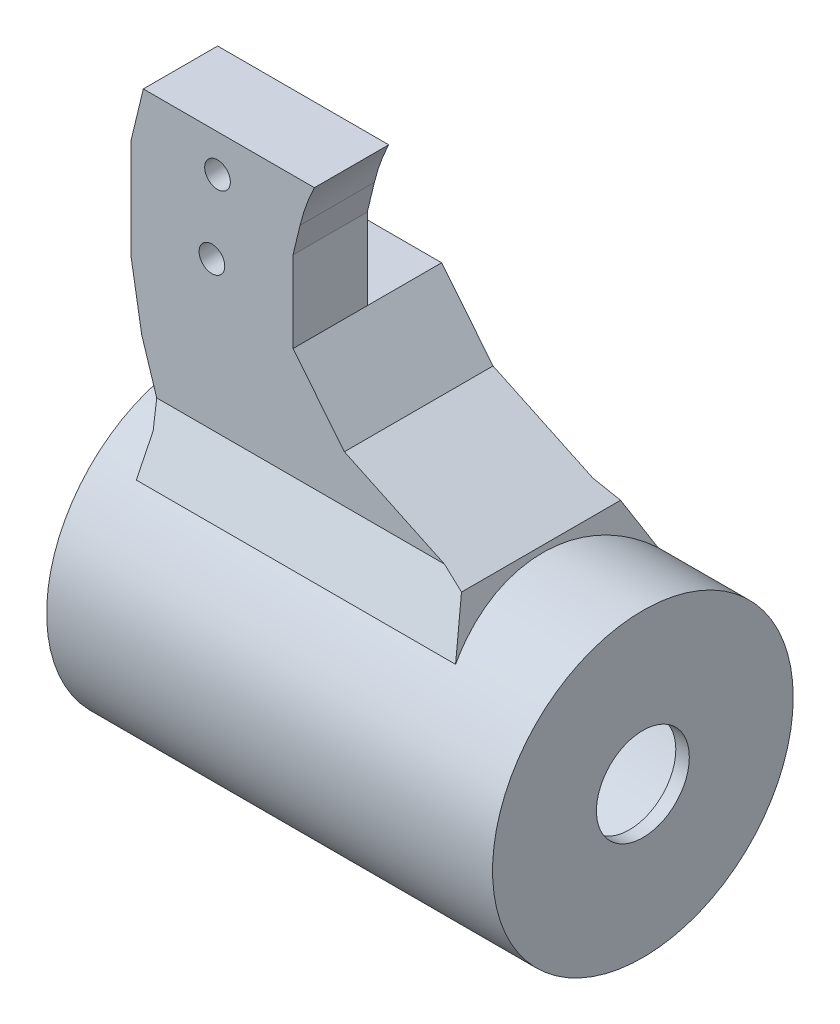
ISO-10303-21;
HEADER;
FILE_DESCRIPTION(('STEP AP214'),'2;1');
FILE_NAME('part.step','',(''),(''),'','','');
FILE_SCHEMA(('AUTOMOTIVE_DESIGN { 1 0 10303 214 1 1 1 1 }'));
ENDSEC;
DATA;
#1=APPLICATION_CONTEXT('core data for automotive mechanical design processes');
#2=APPLICATION_PROTOCOL_DEFINITION('international standard','automotive_design',2000,#1);
#3=PRODUCT_CONTEXT('',#1,'mechanical');
#4=PRODUCT('Part','Part','',(#3));
#5=PRODUCT_RELATED_PRODUCT_CATEGORY('part','',(#4));
#6=PRODUCT_DEFINITION_FORMATION('','',#4);
#7=PRODUCT_DEFINITION_CONTEXT('part definition',#1,'design');
#8=PRODUCT_DEFINITION('design','',#6,#7);
#9=PRODUCT_DEFINITION_SHAPE('','',#8);
#10=(LENGTH_UNIT() NAMED_UNIT(*) SI_UNIT(.MILLI.,.METRE.));
#11=(NAMED_UNIT(*) PLANE_ANGLE_UNIT() SI_UNIT($,.RADIAN.));
#12=(NAMED_UNIT(*) SI_UNIT($,.STERADIAN.) SOLID_ANGLE_UNIT());
#13=UNCERTAINTY_MEASURE_WITH_UNIT(LENGTH_MEASURE(1.E-05),#10,'distance_accuracy_value','');
#14=(GEOMETRIC_REPRESENTATION_CONTEXT(3) GLOBAL_UNCERTAINTY_ASSIGNED_CONTEXT((#13)) GLOBAL_UNIT_ASSIGNED_CONTEXT((#10,
#11,#12)) REPRESENTATION_CONTEXT('',''));
#15=CARTESIAN_POINT('',(0.,0.,0.));
#16=DIRECTION('',(0.,0.,1.));
#17=DIRECTION('',(1.,0.,0.));
#18=AXIS2_PLACEMENT_3D('',#15,#16,#17);
#19=CARTESIAN_POINT('',(-96.,-78.,0.));
#20=DIRECTION('',(1.,0.,0.));
#21=DIRECTION('',(0.,0.,-1.));
#22=AXIS2_PLACEMENT_3D('',#19,#20,#21);
#23=CYLINDRICAL_SURFACE('',#22,19.15);
#24=CARTESIAN_POINT('',(-96.,-78.,0.));
#25=DIRECTION('',(1.,0.,0.));
#26=DIRECTION('',(0.,0.,-1.));
#27=AXIS2_PLACEMENT_3D('',#24,#25,#26);
#28=CIRCLE('',#27,19.15);
#29=CARTESIAN_POINT('',(-96.,-78.,-19.15));
#30=VERTEX_POINT('',#29);
#31=EDGE_CURVE('E1130',#30,#30,#28,.T.);
#32=ORIENTED_EDGE('',*,*,#31,.F.);
#33=EDGE_LOOP('',(#32));
#34=FACE_BOUND('',#33,.T.);
#35=CARTESIAN_POINT('',(-32.,-78.,0.));
#36=DIRECTION('',(1.,0.,0.));
#37=DIRECTION('',(0.,0.,-1.));
#38=AXIS2_PLACEMENT_3D('',#35,#36,#37);
#39=CIRCLE('',#38,19.15);
#40=CARTESIAN_POINT('',(-32.,-78.,-19.15));
#41=VERTEX_POINT('',#40);
#42=EDGE_CURVE('E12',#41,#41,#39,.F.);
#43=ORIENTED_EDGE('',*,*,#42,.F.);
#44=EDGE_LOOP('',(#43));
#45=FACE_BOUND('',#44,.T.);
#46=ADVANCED_FACE('F50',(#34,#45),#23,.F.);
#47=CARTESIAN_POINT('',(-90.,-99.502,11.));
#48=DIRECTION('',(1.,0.,0.));
#49=DIRECTION('',(0.,1.,0.));
#50=AXIS2_PLACEMENT_3D('',#47,#48,#49);
#51=PLANE('',#50);
#52=DIRECTION('',(0.,-0.896679754505563,-0.442679814154478));
#53=VECTOR('',#52,1.);
#54=CARTESIAN_POINT('',(-90.,-81.7522061829768,-24.9534820732049));
#55=LINE('',#54,#53);
#56=CARTESIAN_POINT('',(-90.,-56.5,-12.4867771165009));
#57=VERTEX_POINT('',#56);
#58=CARTESIAN_POINT('',(-90.,-61.5465446919955,-14.9781944314894));
#59=VERTEX_POINT('',#58);
#60=EDGE_CURVE('E323',#57,#59,#55,.T.);
#61=ORIENTED_EDGE('',*,*,#60,.T.);
#62=CARTESIAN_POINT('',(-90.,-78.,0.));
#63=DIRECTION('',(1.,0.,0.));
#64=DIRECTION('',(0.,0.,-1.));
#65=AXIS2_PLACEMENT_3D('',#62,#63,#64);
#66=CIRCLE('',#65,22.25);
#67=CARTESIAN_POINT('',(-90.,-56.5,-5.72821961869481));
#68=VERTEX_POINT('',#67);
#69=EDGE_CURVE('E707',#59,#68,#66,.T.);
#70=ORIENTED_EDGE('',*,*,#69,.T.);
#71=DIRECTION('',(0.,0.,-1.));
#72=VECTOR('',#71,1.);
#73=CARTESIAN_POINT('',(-90.,-56.5,11.));
#74=LINE('',#73,#72);
#75=EDGE_CURVE('E557',#68,#57,#74,.T.);
#76=ORIENTED_EDGE('',*,*,#75,.T.);
#77=EDGE_LOOP('',(#61,#70,#76));
#78=FACE_BOUND('',#77,.T.);
#79=ADVANCED_FACE('F674',(#78),#51,.F.);
#80=CARTESIAN_POINT('',(-94.78651792668,0.,11.));
#81=DIRECTION('',(1.,0.,0.));
#82=DIRECTION('',(0.,1.,0.));
#83=AXIS2_PLACEMENT_3D('',#80,#81,#82);
#84=PLANE('',#83);
#85=DIRECTION('',(0.,-1.,0.));
#86=VECTOR('',#85,1.);
#87=CARTESIAN_POINT('',(-94.78651792668,0.,11.));
#88=LINE('',#87,#86);
#89=CARTESIAN_POINT('',(-94.78651792668,-22.4999999999998,11.));
#90=VERTEX_POINT('',#89);
#91=CARTESIAN_POINT('',(-94.78651792668,-37.0753078944645,11.));
#92=VERTEX_POINT('',#91);
#93=EDGE_CURVE('E260',#90,#92,#88,.T.);
#94=ORIENTED_EDGE('',*,*,#93,.F.);
#95=DIRECTION('',(0.,0.,-1.));
#96=VECTOR('',#95,1.);
#97=CARTESIAN_POINT('',(-94.78651792668,-22.4999999999998,11.));
#98=LINE('',#97,#96);
#99=CARTESIAN_POINT('',(-94.78651792668,-22.4999999999998,0.));
#100=VERTEX_POINT('',#99);
#101=EDGE_CURVE('E215',#90,#100,#98,.T.);
#102=ORIENTED_EDGE('',*,*,#101,.T.);
#103=DIRECTION('',(0.,1.,0.));
#104=VECTOR('',#103,1.);
#105=CARTESIAN_POINT('',(-94.78651792668,-37.0753078944647,0.));
#106=LINE('',#105,#104);
#107=CARTESIAN_POINT('',(-94.78651792668,-37.0753078944647,0.));
#108=VERTEX_POINT('',#107);
#109=EDGE_CURVE('E730',#108,#100,#106,.T.);
#110=ORIENTED_EDGE('',*,*,#109,.F.);
#111=DIRECTION('',(0.,0.,1.));
#112=VECTOR('',#111,1.);
#113=CARTESIAN_POINT('',(-94.78651792668,-37.0753078944645,11.));
#114=LINE('',#113,#112);
#115=EDGE_CURVE('E220',#108,#92,#114,.T.);
#116=ORIENTED_EDGE('',*,*,#115,.T.);
#117=EDGE_LOOP('',(#94,#102,#110,#116));
#118=FACE_BOUND('',#117,.T.);
#119=ADVANCED_FACE('F754',(#118),#84,.F.);
#120=CARTESIAN_POINT('',(-98.0526802844432,-31.1612908883591,11.));
#121=DIRECTION('',(0.95303044179833,0.302874523533558,0.));
#122=DIRECTION('',(0.,0.,-1.));
#123=AXIS2_PLACEMENT_3D('',#120,#121,#122);
#124=PLANE('',#123);
#125=ORIENTED_EDGE('',*,*,#75,.F.);
#126=CARTESIAN_POINT('',(-83.1672673081837,-78.,0.));
#127=DIRECTION('',(0.95303044179833,0.302874523533558,0.));
#128=DIRECTION('',(0.302874523533558,-0.95303044179833,0.));
#129=AXIS2_PLACEMENT_3D('',#126,#127,#128);
#130=ELLIPSE('',#129,23.3465784765649,22.25);
#131=CARTESIAN_POINT('',(-90.,-56.5,5.72821961869481));
#132=VERTEX_POINT('',#131);
#133=EDGE_CURVE('E708',#68,#132,#130,.T.);
#134=ORIENTED_EDGE('',*,*,#133,.T.);
#135=CARTESIAN_POINT('',(-90.,-56.5,12.4867771165009));
#136=VERTEX_POINT('',#135);
#137=EDGE_CURVE('E307',#136,#132,#74,.T.);
#138=ORIENTED_EDGE('',*,*,#137,.F.);
#139=DIRECTION('',(-0.274055906121888,0.862349260154414,-0.425731269500899));
#140=VECTOR('',#139,1.);
#141=CARTESIAN_POINT('',(-96.7666237085848,-35.2080197197201,1.97518719145296));
#142=LINE('',#141,#140);
#143=CARTESIAN_POINT('',(-90.9570827398739,-53.4884261780158,11.));
#144=VERTEX_POINT('',#143);
#145=EDGE_CURVE('E276',#136,#144,#142,.T.);
#146=ORIENTED_EDGE('',*,*,#145,.T.);
#147=DIRECTION('',(0.302874523533558,-0.95303044179833,0.));
#148=VECTOR('',#147,1.);
#149=CARTESIAN_POINT('',(-98.0526802844432,-31.1612908883591,11.));
#150=LINE('',#149,#148);
#151=CARTESIAN_POINT('',(-93.1780152054959,-46.4999999999998,11.));
#152=VERTEX_POINT('',#151);
#153=EDGE_CURVE('E236',#152,#144,#150,.T.);
#154=ORIENTED_EDGE('',*,*,#153,.F.);
#155=DIRECTION('',(0.,0.,-1.));
#156=VECTOR('',#155,1.);
#157=CARTESIAN_POINT('',(-93.1780152054959,-46.4999999999998,11.));
#158=LINE('',#157,#156);
#159=CARTESIAN_POINT('',(-93.1780152054959,-46.4999999999998,-11.));
#160=VERTEX_POINT('',#159);
#161=EDGE_CURVE('E225',#152,#160,#158,.T.);
#162=ORIENTED_EDGE('',*,*,#161,.T.);
#163=DIRECTION('',(0.302874523533558,-0.95303044179833,0.));
#164=VECTOR('',#163,1.);
#165=CARTESIAN_POINT('',(-98.0526802844432,-31.1612908883591,-11.));
#166=LINE('',#165,#164);
#167=CARTESIAN_POINT('',(-90.9570827398739,-53.4884261780158,-11.));
#168=VERTEX_POINT('',#167);
#169=EDGE_CURVE('E277',#160,#168,#166,.T.);
#170=ORIENTED_EDGE('',*,*,#169,.T.);
#171=DIRECTION('',(0.274055906121888,-0.862349260154414,-0.425731269500899));
#172=VECTOR('',#171,1.);
#173=CARTESIAN_POINT('',(-99.3334554227896,-27.1311807235888,2.01224931282567));
#174=LINE('',#173,#172);
#175=EDGE_CURVE('E406',#168,#57,#174,.T.);
#176=ORIENTED_EDGE('',*,*,#175,.T.);
#177=EDGE_LOOP('',(#125,#134,#138,#146,#154,#162,#170,#176));
#178=FACE_BOUND('',#177,.T.);
#179=ADVANCED_FACE('F631',(#178),#124,.F.);
#180=CARTESIAN_POINT('',(-29.471892703518,-62.4156191809848,11.));
#181=DIRECTION('',(0.42698083978432,0.904260671740775,0.));
#182=DIRECTION('',(0.,0.,-1.));
#183=AXIS2_PLACEMENT_3D('',#180,#181,#182);
#184=PLANE('',#183);
#185=DIRECTION('',(0.,0.,-1.));
#186=VECTOR('',#185,1.);
#187=CARTESIAN_POINT('',(-45.0744862839186,-55.0482651447333,0.));
#188=LINE('',#187,#186);
#189=CARTESIAN_POINT('',(-45.0744862839186,-55.0482651447333,11.7700733962463));
#190=VERTEX_POINT('',#189);
#191=CARTESIAN_POINT('',(-45.0744862839186,-55.0482651447333,-11.7700733962463));
#192=VERTEX_POINT('',#191);
#193=EDGE_CURVE('E188',#190,#192,#188,.T.);
#194=ORIENTED_EDGE('',*,*,#193,.T.);
#195=DIRECTION('',(-0.884816093206045,0.417799347398913,0.206262421484465));
#196=VECTOR('',#195,1.);
#197=CARTESIAN_POINT('',(-87.2270216026564,-35.1443530407328,-1.94375573169227));
#198=LINE('',#197,#196);
#199=CARTESIAN_POINT('',(-48.3779156194455,-53.4884261780158,-11.));
#200=VERTEX_POINT('',#199);
#201=EDGE_CURVE('E319',#192,#200,#198,.T.);
#202=ORIENTED_EDGE('',*,*,#201,.T.);
#203=DIRECTION('',(0.904260671740775,-0.42698083978432,0.));
#204=VECTOR('',#203,1.);
#205=CARTESIAN_POINT('',(-29.471892703518,-62.4156191809848,-11.));
#206=LINE('',#205,#204);
#207=CARTESIAN_POINT('',(-63.1780152054959,-46.5,-11.));
#208=VERTEX_POINT('',#207);
#209=EDGE_CURVE('E282',#208,#200,#206,.T.);
#210=ORIENTED_EDGE('',*,*,#209,.F.);
#211=DIRECTION('',(0.,0.,-1.));
#212=VECTOR('',#211,1.);
#213=CARTESIAN_POINT('',(-63.1780152054959,-46.5,11.));
#214=LINE('',#213,#212);
#215=CARTESIAN_POINT('',(-63.1780152054959,-46.5,11.));
#216=VERTEX_POINT('',#215);
#217=EDGE_CURVE('E228',#216,#208,#214,.T.);
#218=ORIENTED_EDGE('',*,*,#217,.F.);
#219=DIRECTION('',(0.904260671740775,-0.42698083978432,0.));
#220=VECTOR('',#219,1.);
#221=CARTESIAN_POINT('',(-29.471892703518,-62.4156191809848,11.));
#222=LINE('',#221,#220);
#223=CARTESIAN_POINT('',(-48.3779156194455,-53.4884261780158,11.));
#224=VERTEX_POINT('',#223);
#225=EDGE_CURVE('E235',#216,#224,#222,.T.);
#226=ORIENTED_EDGE('',*,*,#225,.T.);
#227=DIRECTION('',(0.884816093206045,-0.417799347398913,0.206262421484465));
#228=VECTOR('',#227,1.);
#229=CARTESIAN_POINT('',(-87.2270216026564,-35.1443530407328,1.94375573169227));
#230=LINE('',#229,#228);
#231=EDGE_CURVE('E193',#224,#190,#230,.T.);
#232=ORIENTED_EDGE('',*,*,#231,.T.);
#233=EDGE_LOOP('',(#194,#202,#210,#218,#226,#232));
#234=FACE_BOUND('',#233,.T.);
#235=ADVANCED_FACE('F811',(#234),#184,.T.);
#236=CARTESIAN_POINT('',(-60.9770040591636,-49.2264040160328,11.));
#237=DIRECTION('',(0.778092434340065,0.628149793936726,0.));
#238=DIRECTION('',(0.,0.,-1.));
#239=AXIS2_PLACEMENT_3D('',#236,#237,#238);
#240=PLANE('',#239);
#241=DIRECTION('',(0.628149793936726,-0.778092434340065,0.));
#242=VECTOR('',#241,1.);
#243=CARTESIAN_POINT('',(-60.9770040591636,-49.2264040160328,-11.));
#244=LINE('',#243,#242);
#245=CARTESIAN_POINT('',(-70.78651792668,-37.0753078944647,-11.));
#246=VERTEX_POINT('',#245);
#247=EDGE_CURVE('E281',#246,#208,#244,.T.);
#248=ORIENTED_EDGE('',*,*,#247,.F.);
#249=DIRECTION('',(0.,0.,1.));
#250=VECTOR('',#249,1.);
#251=CARTESIAN_POINT('',(-70.78651792668,-37.0753078944647,0.));
#252=LINE('',#251,#250);
#253=CARTESIAN_POINT('',(-70.78651792668,-37.0753078944647,0.));
#254=VERTEX_POINT('',#253);
#255=EDGE_CURVE('E326',#246,#254,#252,.T.);
#256=ORIENTED_EDGE('',*,*,#255,.T.);
#257=CARTESIAN_POINT('',(-70.78651792668,-37.0753078944647,11.));
#258=VERTEX_POINT('',#257);
#259=EDGE_CURVE('E659',#254,#258,#252,.T.);
#260=ORIENTED_EDGE('',*,*,#259,.T.);
#261=DIRECTION('',(0.628149793936726,-0.778092434340065,0.));
#262=VECTOR('',#261,1.);
#263=CARTESIAN_POINT('',(-60.9770040591636,-49.2264040160328,11.));
#264=LINE('',#263,#262);
#265=EDGE_CURVE('E229',#258,#216,#264,.T.);
#266=ORIENTED_EDGE('',*,*,#265,.T.);
#267=ORIENTED_EDGE('',*,*,#217,.T.);
#268=EDGE_LOOP('',(#248,#256,#260,#266,#267));
#269=FACE_BOUND('',#268,.T.);
#270=ADVANCED_FACE('F766',(#269),#240,.T.);
#271=CARTESIAN_POINT('',(-70.7865179266799,0.,11.));
#272=DIRECTION('',(1.,0.,0.));
#273=DIRECTION('',(0.,-1.,0.));
#274=AXIS2_PLACEMENT_3D('',#271,#272,#273);
#275=PLANE('',#274);
#276=DIRECTION('',(0.,-1.,0.));
#277=VECTOR('',#276,1.);
#278=CARTESIAN_POINT('',(-70.78651792668,-25.0753078944647,0.));
#279=LINE('',#278,#277);
#280=CARTESIAN_POINT('',(-70.78651792668,-25.0753078944647,0.));
#281=VERTEX_POINT('',#280);
#282=EDGE_CURVE('E739',#281,#254,#279,.T.);
#283=ORIENTED_EDGE('',*,*,#282,.F.);
#284=DIRECTION('',(0.,0.,-1.));
#285=VECTOR('',#284,1.);
#286=CARTESIAN_POINT('',(-70.78651792668,-25.0753078944647,11.));
#287=LINE('',#286,#285);
#288=CARTESIAN_POINT('',(-70.78651792668,-25.0753078944647,11.));
#289=VERTEX_POINT('',#288);
#290=EDGE_CURVE('E411',#289,#281,#287,.T.);
#291=ORIENTED_EDGE('',*,*,#290,.F.);
#292=DIRECTION('',(0.,-1.,0.));
#293=VECTOR('',#292,1.);
#294=CARTESIAN_POINT('',(-70.7865179266799,0.,11.));
#295=LINE('',#294,#293);
#296=EDGE_CURVE('E234',#289,#258,#295,.T.);
#297=ORIENTED_EDGE('',*,*,#296,.T.);
#298=ORIENTED_EDGE('',*,*,#259,.F.);
#299=EDGE_LOOP('',(#283,#291,#297,#298));
#300=FACE_BOUND('',#299,.T.);
#301=ADVANCED_FACE('F765',(#300),#275,.T.);
#302=CARTESIAN_POINT('',(-61.1505130339722,14.7833893946223,11.));
#303=DIRECTION('',(0.971999047761115,-0.234984789191738,0.));
#304=DIRECTION('',(0.,0.,-1.));
#305=AXIS2_PLACEMENT_3D('',#302,#303,#304);
#306=PLANE('',#305);
#307=DIRECTION('',(-0.234984789191742,-0.971999047761114,0.));
#308=VECTOR('',#307,1.);
#309=CARTESIAN_POINT('',(-69.738862808107,-20.7417517475428,0.));
#310=LINE('',#309,#308);
#311=CARTESIAN_POINT('',(-69.738862808107,-20.7417517475428,0.));
#312=VERTEX_POINT('',#311);
#313=EDGE_CURVE('E737',#312,#281,#310,.T.);
#314=ORIENTED_EDGE('',*,*,#313,.F.);
#315=DIRECTION('',(0.,0.,-1.));
#316=VECTOR('',#315,1.);
#317=CARTESIAN_POINT('',(-69.738862808107,-20.7417517475428,11.));
#318=LINE('',#317,#316);
#319=CARTESIAN_POINT('',(-69.738862808107,-20.7417517475428,11.));
#320=VERTEX_POINT('',#319);
#321=EDGE_CURVE('E283',#320,#312,#318,.T.);
#322=ORIENTED_EDGE('',*,*,#321,.F.);
#323=DIRECTION('',(-0.234984789191738,-0.971999047761115,0.));
#324=VECTOR('',#323,1.);
#325=CARTESIAN_POINT('',(-61.1505130339722,14.7833893946223,11.));
#326=LINE('',#325,#324);
#327=EDGE_CURVE('E253',#320,#289,#326,.T.);
#328=ORIENTED_EDGE('',*,*,#327,.T.);
#329=ORIENTED_EDGE('',*,*,#290,.T.);
#330=EDGE_LOOP('',(#314,#322,#328,#329));
#331=FACE_BOUND('',#330,.T.);
#332=ADVANCED_FACE('F761',(#331),#306,.T.);
#333=CARTESIAN_POINT('',(-41.8993681465749,-27.4720647034177,11.));
#334=DIRECTION('',(0.,0.,-1.));
#335=DIRECTION('',(-1.,0.,0.));
#336=AXIS2_PLACEMENT_3D('',#333,#334,#335);
#337=CYLINDRICAL_SURFACE('',#336,28.6414834722905);
#338=ORIENTED_EDGE('',*,*,#321,.T.);
#339=CARTESIAN_POINT('',(-41.8993681465749,-27.4720647034177,0.));
#340=DIRECTION('',(0.,0.,1.));
#341=DIRECTION('',(1.,0.,0.));
#342=AXIS2_PLACEMENT_3D('',#339,#340,#341);
#343=CIRCLE('',#342,28.6414834722905);
#344=CARTESIAN_POINT('',(-67.6192286908768,-14.8695511019509,0.));
#345=VERTEX_POINT('',#344);
#346=EDGE_CURVE('E735',#345,#312,#343,.T.);
#347=ORIENTED_EDGE('',*,*,#346,.F.);
#348=DIRECTION('',(0.,0.,-1.));
#349=VECTOR('',#348,1.);
#350=CARTESIAN_POINT('',(-67.6192286908768,-14.8695511019509,11.));
#351=LINE('',#350,#349);
#352=CARTESIAN_POINT('',(-67.6192286908768,-14.8695511019509,11.));
#353=VERTEX_POINT('',#352);
#354=EDGE_CURVE('E553',#353,#345,#351,.T.);
#355=ORIENTED_EDGE('',*,*,#354,.F.);
#356=CARTESIAN_POINT('',(-41.8993681465749,-27.4720647034177,11.));
#357=DIRECTION('',(0.,0.,-1.));
#358=DIRECTION('',(1.,0.,0.));
#359=AXIS2_PLACEMENT_3D('',#356,#357,#358);
#360=CIRCLE('',#359,28.6414834722905);
#361=EDGE_CURVE('E257',#320,#353,#360,.T.);
#362=ORIENTED_EDGE('',*,*,#361,.F.);
#363=EDGE_LOOP('',(#338,#347,#355,#362));
#364=FACE_BOUND('',#363,.T.);
#365=ADVANCED_FACE('F759',(#364),#337,.F.);
#366=CARTESIAN_POINT('',(0.,0.,11.));
#367=DIRECTION('',(0.,0.,1.));
#368=DIRECTION('',(1.,0.,0.));
#369=AXIS2_PLACEMENT_3D('',#366,#367,#368);
#370=PLANE('',#369);
#371=CARTESIAN_POINT('',(-82.78651792668,-31.5753078944647,11.));
#372=DIRECTION('',(0.,0.,1.));
#373=DIRECTION('',(1.,0.,0.));
#374=AXIS2_PLACEMENT_3D('',#371,#372,#373);
#375=CIRCLE('',#374,1.89999999999999);
#376=CARTESIAN_POINT('',(-80.88651792668,-31.5753078944647,11.));
#377=VERTEX_POINT('',#376);
#378=EDGE_CURVE('E711',#377,#377,#375,.T.);
#379=ORIENTED_EDGE('',*,*,#378,.F.);
#380=EDGE_LOOP('',(#379));
#381=FACE_BOUND('',#380,.T.);
#382=CARTESIAN_POINT('',(-81.960177429347,-20.3695511019509,11.));
#383=DIRECTION('',(0.,0.,1.));
#384=DIRECTION('',(1.,0.,0.));
#385=AXIS2_PLACEMENT_3D('',#382,#383,#384);
#386=CIRCLE('',#385,1.89999999999999);
#387=CARTESIAN_POINT('',(-80.060177429347,-20.3695511019509,11.));
#388=VERTEX_POINT('',#387);
#389=EDGE_CURVE('E720',#388,#388,#386,.T.);
#390=ORIENTED_EDGE('',*,*,#389,.F.);
#391=EDGE_LOOP('',(#390));
#392=FACE_BOUND('',#391,.T.);
#393=DIRECTION('',(-1.,0.,0.));
#394=VECTOR('',#393,1.);
#395=CARTESIAN_POINT('',(26.001,-14.8695511019509,11.));
#396=LINE('',#395,#394);
#397=CARTESIAN_POINT('',(-92.9418253522619,-14.8695511019509,11.));
#398=VERTEX_POINT('',#397);
#399=EDGE_CURVE('E304',#353,#398,#396,.T.);
#400=ORIENTED_EDGE('',*,*,#399,.T.);
#401=DIRECTION('',(0.234984789191741,0.971999047761114,0.));
#402=VECTOR('',#401,1.);
#403=CARTESIAN_POINT('',(-84.4134977836507,20.4073121545935,11.));
#404=LINE('',#403,#402);
#405=EDGE_CURVE('E209',#398,#90,#404,.F.);
#406=ORIENTED_EDGE('',*,*,#405,.T.);
#407=ORIENTED_EDGE('',*,*,#93,.T.);
#408=DIRECTION('',(-0.168236394169371,0.98574667926242,0.));
#409=VECTOR('',#408,1.);
#410=CARTESIAN_POINT('',(-98.2522414229531,-16.7686112099554,11.));
#411=LINE('',#410,#409);
#412=EDGE_CURVE('E218',#92,#152,#411,.F.);
#413=ORIENTED_EDGE('',*,*,#412,.T.);
#414=ORIENTED_EDGE('',*,*,#153,.T.);
#415=DIRECTION('',(1.,0.,0.));
#416=VECTOR('',#415,1.);
#417=CARTESIAN_POINT('',(-42.,-53.4884261780158,11.));
#418=LINE('',#417,#416);
#419=EDGE_CURVE('E271',#144,#224,#418,.T.);
#420=ORIENTED_EDGE('',*,*,#419,.T.);
#421=ORIENTED_EDGE('',*,*,#225,.F.);
#422=ORIENTED_EDGE('',*,*,#265,.F.);
#423=ORIENTED_EDGE('',*,*,#296,.F.);
#424=ORIENTED_EDGE('',*,*,#327,.F.);
#425=ORIENTED_EDGE('',*,*,#361,.T.);
#426=EDGE_LOOP('',(#400,#406,#407,#413,#414,#420,#421,#422,#423,#424,#425));
#427=FACE_BOUND('',#426,.T.);
#428=ADVANCED_FACE('F623',(#381,#392,#427),#370,.T.);
#429=CARTESIAN_POINT('',(0.,0.,-11.));
#430=DIRECTION('',(0.,0.,1.));
#431=DIRECTION('',(1.,0.,0.));
#432=AXIS2_PLACEMENT_3D('',#429,#430,#431);
#433=PLANE('',#432);
#434=ORIENTED_EDGE('',*,*,#169,.F.);
#435=DIRECTION('',(0.168236394169371,-0.98574667926242,0.));
#436=VECTOR('',#435,1.);
#437=CARTESIAN_POINT('',(-93.1780152054959,-46.4999999999998,-11.));
#438=LINE('',#437,#436);
#439=CARTESIAN_POINT('',(-94.78651792668,-37.0753078944647,-11.));
#440=VERTEX_POINT('',#439);
#441=EDGE_CURVE('E223',#160,#440,#438,.F.);
#442=ORIENTED_EDGE('',*,*,#441,.T.);
#443=DIRECTION('',(-1.,0.,0.));
#444=VECTOR('',#443,1.);
#445=CARTESIAN_POINT('',(-70.78651792668,-37.0753078944647,-11.));
#446=LINE('',#445,#444);
#447=EDGE_CURVE('E726',#246,#440,#446,.T.);
#448=ORIENTED_EDGE('',*,*,#447,.F.);
#449=ORIENTED_EDGE('',*,*,#247,.T.);
#450=ORIENTED_EDGE('',*,*,#209,.T.);
#451=DIRECTION('',(-1.,0.,0.));
#452=VECTOR('',#451,1.);
#453=CARTESIAN_POINT('',(0.,-53.4884261780158,-11.));
#454=LINE('',#453,#452);
#455=EDGE_CURVE('E254',#200,#168,#454,.T.);
#456=ORIENTED_EDGE('',*,*,#455,.T.);
#457=EDGE_LOOP('',(#434,#442,#448,#449,#450,#456));
#458=FACE_BOUND('',#457,.T.);
#459=ADVANCED_FACE('F671',(#458),#433,.F.);
#460=ORIENTED_EDGE('',*,*,#137,.T.);
#461=CARTESIAN_POINT('',(-90.,-61.5465446919955,14.9781944314894));
#462=VERTEX_POINT('',#461);
#463=EDGE_CURVE('E709',#132,#462,#66,.T.);
#464=ORIENTED_EDGE('',*,*,#463,.T.);
#465=DIRECTION('',(0.,0.896679754505563,-0.442679814154478));
#466=VECTOR('',#465,1.);
#467=CARTESIAN_POINT('',(-90.,-90.4849307787501,29.2647212661215));
#468=LINE('',#467,#466);
#469=EDGE_CURVE('E200',#462,#136,#468,.T.);
#470=ORIENTED_EDGE('',*,*,#469,.T.);
#471=EDGE_LOOP('',(#460,#464,#470));
#472=FACE_BOUND('',#471,.T.);
#473=ADVANCED_FACE('F664',(#472),#51,.F.);
#474=CARTESIAN_POINT('',(26.001,-14.8695511019509,34.8757613114755));
#475=DIRECTION('',(0.,-1.,0.));
#476=DIRECTION('',(-1.,0.,0.));
#477=AXIS2_PLACEMENT_3D('',#474,#475,#476);
#478=PLANE('',#477);
#479=DIRECTION('',(1.,0.,0.));
#480=VECTOR('',#479,1.);
#481=CARTESIAN_POINT('',(-94.78651792668,-14.8695511019509,0.));
#482=LINE('',#481,#480);
#483=CARTESIAN_POINT('',(-92.9418253522619,-14.8695511019509,0.));
#484=VERTEX_POINT('',#483);
#485=EDGE_CURVE('E733',#484,#345,#482,.T.);
#486=ORIENTED_EDGE('',*,*,#485,.F.);
#487=DIRECTION('',(0.,0.,1.));
#488=VECTOR('',#487,1.);
#489=CARTESIAN_POINT('',(-92.9418253522619,-14.8695511019509,34.8757613114755));
#490=LINE('',#489,#488);
#491=EDGE_CURVE('E73',#484,#398,#490,.T.);
#492=ORIENTED_EDGE('',*,*,#491,.T.);
#493=ORIENTED_EDGE('',*,*,#399,.F.);
#494=ORIENTED_EDGE('',*,*,#354,.T.);
#495=EDGE_LOOP('',(#486,#492,#493,#494));
#496=FACE_BOUND('',#495,.T.);
#497=ADVANCED_FACE('F670',(#496),#478,.F.);
#498=CARTESIAN_POINT('',(-98.,-53.4884261780158,-11.));
#499=DIRECTION('',(0.,-0.442679814154478,0.896679754505563));
#500=DIRECTION('',(-1.,0.,0.));
#501=AXIS2_PLACEMENT_3D('',#498,#499,#500);
#502=PLANE('',#501);
#503=DIRECTION('',(0.30605332364349,-0.85365201270775,-0.421437544942048));
#504=VECTOR('',#503,1.);
#505=CARTESIAN_POINT('',(-48.0114241183984,-46.8564805767549,-7.72588967075807));
#506=LINE('',#505,#504);
#507=CARTESIAN_POINT('',(-42.7447078451662,-61.5465446919955,-14.9781944314894));
#508=VERTEX_POINT('',#507);
#509=EDGE_CURVE('E303',#192,#508,#506,.T.);
#510=ORIENTED_EDGE('',*,*,#509,.T.);
#511=DIRECTION('',(1.,0.,0.));
#512=VECTOR('',#511,1.);
#513=CARTESIAN_POINT('',(-94.78651792668,-61.5465446919955,-14.9781944314894));
#514=LINE('',#513,#512);
#515=EDGE_CURVE('E203',#508,#59,#514,.F.);
#516=ORIENTED_EDGE('',*,*,#515,.T.);
#517=ORIENTED_EDGE('',*,*,#60,.F.);
#518=ORIENTED_EDGE('',*,*,#175,.F.);
#519=ORIENTED_EDGE('',*,*,#455,.F.);
#520=ORIENTED_EDGE('',*,*,#201,.F.);
#521=EDGE_LOOP('',(#510,#516,#517,#518,#519,#520));
#522=FACE_BOUND('',#521,.T.);
#523=ADVANCED_FACE('F705',(#522),#502,.F.);
#524=CARTESIAN_POINT('',(-98.,-53.4884261780158,11.));
#525=DIRECTION('',(0.,0.442679814154478,0.896679754505563));
#526=DIRECTION('',(1.,0.,0.));
#527=AXIS2_PLACEMENT_3D('',#524,#525,#526);
#528=PLANE('',#527);
#529=DIRECTION('',(1.,0.,0.));
#530=VECTOR('',#529,1.);
#531=CARTESIAN_POINT('',(-94.78651792668,-61.5465446919955,14.9781944314894));
#532=LINE('',#531,#530);
#533=CARTESIAN_POINT('',(-42.7447078451662,-61.5465446919955,14.9781944314894));
#534=VERTEX_POINT('',#533);
#535=EDGE_CURVE('E197',#534,#462,#532,.F.);
#536=ORIENTED_EDGE('',*,*,#535,.F.);
#537=DIRECTION('',(-0.30605332364349,0.85365201270775,-0.421437544942048));
#538=VECTOR('',#537,1.);
#539=CARTESIAN_POINT('',(-45.1738121689698,-54.7712227631035,11.6333009650672));
#540=LINE('',#539,#538);
#541=EDGE_CURVE('E184',#534,#190,#540,.T.);
#542=ORIENTED_EDGE('',*,*,#541,.T.);
#543=ORIENTED_EDGE('',*,*,#231,.F.);
#544=ORIENTED_EDGE('',*,*,#419,.F.);
#545=ORIENTED_EDGE('',*,*,#145,.F.);
#546=ORIENTED_EDGE('',*,*,#469,.F.);
#547=EDGE_LOOP('',(#536,#542,#543,#544,#545,#546));
#548=FACE_BOUND('',#547,.T.);
#549=ADVANCED_FACE('F198',(#548),#528,.T.);
#550=CARTESIAN_POINT('',(-45.0744862839186,-55.0482651447333,11.));
#551=DIRECTION('',(0.941329900196425,0.337487805699981,0.));
#552=DIRECTION('',(0.,0.,-1.));
#553=AXIS2_PLACEMENT_3D('',#550,#551,#552);
#554=PLANE('',#553);
#555=CARTESIAN_POINT('',(-36.8457764217381,-78.,0.));
#556=DIRECTION('',(0.941329900196425,0.337487805699981,0.));
#557=DIRECTION('',(0.337487805699981,-0.941329900196425,0.));
#558=AXIS2_PLACEMENT_3D('',#555,#556,#557);
#559=ELLIPSE('',#558,23.6367717580809,22.25);
#560=EDGE_CURVE('E59',#508,#534,#559,.T.);
#561=ORIENTED_EDGE('',*,*,#560,.F.);
#562=ORIENTED_EDGE('',*,*,#509,.F.);
#563=ORIENTED_EDGE('',*,*,#193,.F.);
#564=ORIENTED_EDGE('',*,*,#541,.F.);
#565=EDGE_LOOP('',(#561,#562,#563,#564));
#566=FACE_BOUND('',#565,.T.);
#567=ADVANCED_FACE('F186',(#566),#554,.T.);
#568=CARTESIAN_POINT('',(-70.78651792668,-37.0753078944647,0.));
#569=DIRECTION('',(0.,-1.,0.));
#570=DIRECTION('',(0.,0.,-1.));
#571=AXIS2_PLACEMENT_3D('',#568,#569,#570);
#572=PLANE('',#571);
#573=ORIENTED_EDGE('',*,*,#447,.T.);
#574=DIRECTION('',(0.,0.,-1.));
#575=VECTOR('',#574,1.);
#576=CARTESIAN_POINT('',(-94.78651792668,-37.0753078944647,0.));
#577=LINE('',#576,#575);
#578=EDGE_CURVE('E651',#108,#440,#577,.T.);
#579=ORIENTED_EDGE('',*,*,#578,.F.);
#580=DIRECTION('',(-1.,0.,0.));
#581=VECTOR('',#580,1.);
#582=CARTESIAN_POINT('',(-70.78651792668,-37.0753078944647,0.));
#583=LINE('',#582,#581);
#584=EDGE_CURVE('E727',#254,#108,#583,.T.);
#585=ORIENTED_EDGE('',*,*,#584,.F.);
#586=ORIENTED_EDGE('',*,*,#255,.F.);
#587=EDGE_LOOP('',(#573,#579,#585,#586));
#588=FACE_BOUND('',#587,.T.);
#589=ADVANCED_FACE('F748',(#588),#572,.F.);
#590=CARTESIAN_POINT('',(-41.8993681465749,-27.4720647034177,0.));
#591=DIRECTION('',(0.,0.,1.));
#592=DIRECTION('',(1.,0.,0.));
#593=AXIS2_PLACEMENT_3D('',#590,#591,#592);
#594=PLANE('',#593);
#595=CARTESIAN_POINT('',(-82.78651792668,-31.5753078944647,0.));
#596=DIRECTION('',(0.,0.,1.));
#597=DIRECTION('',(1.,0.,0.));
#598=AXIS2_PLACEMENT_3D('',#595,#596,#597);
#599=CIRCLE('',#598,1.89999999999999);
#600=CARTESIAN_POINT('',(-80.88651792668,-31.5753078944647,0.));
#601=VERTEX_POINT('',#600);
#602=EDGE_CURVE('E717',#601,#601,#599,.T.);
#603=ORIENTED_EDGE('',*,*,#602,.T.);
#604=EDGE_LOOP('',(#603));
#605=FACE_BOUND('',#604,.T.);
#606=CARTESIAN_POINT('',(-81.960177429347,-20.3695511019509,0.));
#607=DIRECTION('',(0.,0.,1.));
#608=DIRECTION('',(1.,0.,0.));
#609=AXIS2_PLACEMENT_3D('',#606,#607,#608);
#610=CIRCLE('',#609,1.89999999999999);
#611=CARTESIAN_POINT('',(-80.060177429347,-20.3695511019509,0.));
#612=VERTEX_POINT('',#611);
#613=EDGE_CURVE('E723',#612,#612,#610,.T.);
#614=ORIENTED_EDGE('',*,*,#613,.T.);
#615=EDGE_LOOP('',(#614));
#616=FACE_BOUND('',#615,.T.);
#617=ORIENTED_EDGE('',*,*,#109,.T.);
#618=DIRECTION('',(-0.234984789191741,-0.971999047761114,0.));
#619=VECTOR('',#618,1.);
#620=CARTESIAN_POINT('',(-94.78651792668,-22.4999999999998,0.));
#621=LINE('',#620,#619);
#622=EDGE_CURVE('E213',#100,#484,#621,.F.);
#623=ORIENTED_EDGE('',*,*,#622,.T.);
#624=ORIENTED_EDGE('',*,*,#485,.T.);
#625=ORIENTED_EDGE('',*,*,#346,.T.);
#626=ORIENTED_EDGE('',*,*,#313,.T.);
#627=ORIENTED_EDGE('',*,*,#282,.T.);
#628=ORIENTED_EDGE('',*,*,#584,.T.);
#629=EDGE_LOOP('',(#617,#623,#624,#625,#626,#627,#628));
#630=FACE_BOUND('',#629,.T.);
#631=ADVANCED_FACE('F751',(#605,#616,#630),#594,.F.);
#632=CARTESIAN_POINT('',(-81.960177429347,-20.3695511019509,11.));
#633=DIRECTION('',(0.,0.,1.));
#634=DIRECTION('',(1.,0.,0.));
#635=AXIS2_PLACEMENT_3D('',#632,#633,#634);
#636=CYLINDRICAL_SURFACE('',#635,1.89999999999999);
#637=ORIENTED_EDGE('',*,*,#389,.T.);
#638=EDGE_LOOP('',(#637));
#639=FACE_BOUND('',#638,.T.);
#640=ORIENTED_EDGE('',*,*,#613,.F.);
#641=EDGE_LOOP('',(#640));
#642=FACE_BOUND('',#641,.T.);
#643=ADVANCED_FACE('F797',(#639,#642),#636,.F.);
#644=CARTESIAN_POINT('',(-82.78651792668,-31.5753078944647,11.));
#645=DIRECTION('',(0.,0.,1.));
#646=DIRECTION('',(1.,0.,0.));
#647=AXIS2_PLACEMENT_3D('',#644,#645,#646);
#648=CYLINDRICAL_SURFACE('',#647,1.89999999999999);
#649=ORIENTED_EDGE('',*,*,#378,.T.);
#650=EDGE_LOOP('',(#649));
#651=FACE_BOUND('',#650,.T.);
#652=ORIENTED_EDGE('',*,*,#602,.F.);
#653=EDGE_LOOP('',(#652));
#654=FACE_BOUND('',#653,.T.);
#655=ADVANCED_FACE('F794',(#651,#654),#648,.F.);
#656=CARTESIAN_POINT('',(-93.1780152054959,-46.4999999999998,11.));
#657=DIRECTION('',(0.98574667926242,0.168236394169371,0.));
#658=DIRECTION('',(0.,0.,-1.));
#659=AXIS2_PLACEMENT_3D('',#656,#657,#658);
#660=PLANE('',#659);
#661=ORIENTED_EDGE('',*,*,#115,.F.);
#662=ORIENTED_EDGE('',*,*,#578,.T.);
#663=ORIENTED_EDGE('',*,*,#441,.F.);
#664=ORIENTED_EDGE('',*,*,#161,.F.);
#665=ORIENTED_EDGE('',*,*,#412,.F.);
#666=EDGE_LOOP('',(#661,#662,#663,#664,#665));
#667=FACE_BOUND('',#666,.T.);
#668=ADVANCED_FACE('F746',(#667),#660,.F.);
#669=CARTESIAN_POINT('',(-94.78651792668,-22.4999999999998,11.));
#670=DIRECTION('',(0.971999047761114,-0.234984789191741,0.));
#671=DIRECTION('',(0.,0.,-1.));
#672=AXIS2_PLACEMENT_3D('',#669,#670,#671);
#673=PLANE('',#672);
#674=ORIENTED_EDGE('',*,*,#405,.F.);
#675=ORIENTED_EDGE('',*,*,#491,.F.);
#676=ORIENTED_EDGE('',*,*,#622,.F.);
#677=ORIENTED_EDGE('',*,*,#101,.F.);
#678=EDGE_LOOP('',(#674,#675,#676,#677));
#679=FACE_BOUND('',#678,.T.);
#680=ADVANCED_FACE('F53',(#679),#673,.F.);
#681=CARTESIAN_POINT('',(-96.,-78.,0.));
#682=DIRECTION('',(1.,0.,0.));
#683=DIRECTION('',(0.,0.,-1.));
#684=AXIS2_PLACEMENT_3D('',#681,#682,#683);
#685=CYLINDRICAL_SURFACE('',#684,22.25);
#686=CARTESIAN_POINT('',(-30.,-78.,0.));
#687=DIRECTION('',(1.,0.,0.));
#688=DIRECTION('',(0.,0.,-1.));
#689=AXIS2_PLACEMENT_3D('',#686,#687,#688);
#690=CIRCLE('',#689,22.25);
#691=CARTESIAN_POINT('',(-30.,-78.,-22.25));
#692=VERTEX_POINT('',#691);
#693=EDGE_CURVE('E1125',#692,#692,#690,.T.);
#694=ORIENTED_EDGE('',*,*,#693,.F.);
#695=EDGE_LOOP('',(#694));
#696=FACE_BOUND('',#695,.T.);
#697=CARTESIAN_POINT('',(-96.,-78.,0.));
#698=DIRECTION('',(1.,0.,0.));
#699=DIRECTION('',(0.,0.,-1.));
#700=AXIS2_PLACEMENT_3D('',#697,#698,#699);
#701=CIRCLE('',#700,22.25);
#702=CARTESIAN_POINT('',(-96.,-78.,-22.25));
#703=VERTEX_POINT('',#702);
#704=EDGE_CURVE('E204',#703,#703,#701,.T.);
#705=ORIENTED_EDGE('',*,*,#704,.T.);
#706=EDGE_LOOP('',(#705));
#707=FACE_BOUND('',#706,.T.);
#708=ORIENTED_EDGE('',*,*,#69,.F.);
#709=ORIENTED_EDGE('',*,*,#515,.F.);
#710=ORIENTED_EDGE('',*,*,#560,.T.);
#711=ORIENTED_EDGE('',*,*,#535,.T.);
#712=ORIENTED_EDGE('',*,*,#463,.F.);
#713=ORIENTED_EDGE('',*,*,#133,.F.);
#714=EDGE_LOOP('',(#708,#709,#710,#711,#712,#713));
#715=FACE_BOUND('',#714,.T.);
#716=ADVANCED_FACE('F208',(#696,#707,#715),#685,.T.);
#717=CARTESIAN_POINT('',(-96.,-78.,0.));
#718=DIRECTION('',(1.,0.,0.));
#719=DIRECTION('',(0.,0.,-1.));
#720=AXIS2_PLACEMENT_3D('',#717,#718,#719);
#721=PLANE('',#720);
#722=ORIENTED_EDGE('',*,*,#31,.T.);
#723=EDGE_LOOP('',(#722));
#724=FACE_BOUND('',#723,.T.);
#725=ORIENTED_EDGE('',*,*,#704,.F.);
#726=EDGE_LOOP('',(#725));
#727=FACE_BOUND('',#726,.T.);
#728=ADVANCED_FACE('F787',(#724,#727),#721,.F.);
#729=CARTESIAN_POINT('',(-30.,-78.,0.));
#730=DIRECTION('',(1.,0.,0.));
#731=DIRECTION('',(0.,0.,-1.));
#732=AXIS2_PLACEMENT_3D('',#729,#730,#731);
#733=PLANE('',#732);
#734=ORIENTED_EDGE('',*,*,#693,.T.);
#735=EDGE_LOOP('',(#734));
#736=FACE_BOUND('',#735,.T.);
#737=CARTESIAN_POINT('',(-30.,-78.,0.));
#738=DIRECTION('',(1.,0.,0.));
#739=DIRECTION('',(0.,0.,-1.));
#740=AXIS2_PLACEMENT_3D('',#737,#738,#739);
#741=CIRCLE('',#740,6.875);
#742=CARTESIAN_POINT('',(-30.,-78.,-6.875));
#743=VERTEX_POINT('',#742);
#744=EDGE_CURVE('E1122',#743,#743,#741,.T.);
#745=ORIENTED_EDGE('',*,*,#744,.F.);
#746=EDGE_LOOP('',(#745));
#747=FACE_BOUND('',#746,.T.);
#748=ADVANCED_FACE('F785',(#736,#747),#733,.T.);
#749=CARTESIAN_POINT('',(-32.,-78.,0.));
#750=DIRECTION('',(1.,0.,0.));
#751=DIRECTION('',(0.,0.,-1.));
#752=AXIS2_PLACEMENT_3D('',#749,#750,#751);
#753=PLANE('',#752);
#754=CARTESIAN_POINT('',(-32.,-78.,0.));
#755=DIRECTION('',(1.,0.,0.));
#756=DIRECTION('',(0.,0.,-1.));
#757=AXIS2_PLACEMENT_3D('',#754,#755,#756);
#758=CIRCLE('',#757,6.875);
#759=CARTESIAN_POINT('',(-32.,-78.,-6.875));
#760=VERTEX_POINT('',#759);
#761=EDGE_CURVE('E1119',#760,#760,#758,.T.);
#762=ORIENTED_EDGE('',*,*,#761,.T.);
#763=EDGE_LOOP('',(#762));
#764=FACE_BOUND('',#763,.T.);
#765=ORIENTED_EDGE('',*,*,#42,.T.);
#766=EDGE_LOOP('',(#765));
#767=FACE_BOUND('',#766,.T.);
#768=ADVANCED_FACE('F868',(#764,#767),#753,.F.);
#769=CARTESIAN_POINT('',(-32.,-78.,0.));
#770=DIRECTION('',(1.,0.,0.));
#771=DIRECTION('',(0.,0.,-1.));
#772=AXIS2_PLACEMENT_3D('',#769,#770,#771);
#773=CYLINDRICAL_SURFACE('',#772,6.875);
#774=ORIENTED_EDGE('',*,*,#761,.F.);
#775=EDGE_LOOP('',(#774));
#776=FACE_BOUND('',#775,.T.);
#777=ORIENTED_EDGE('',*,*,#744,.T.);
#778=EDGE_LOOP('',(#777));
#779=FACE_BOUND('',#778,.T.);
#780=ADVANCED_FACE('F875',(#776,#779),#773,.F.);
#781=CLOSED_SHELL('',(#46,#79,#119,#179,#235,#270,#301,#332,#365,#428,#459,#473,#497,#523,#549,
#567,#589,#631,#643,#655,#668,#680,#716,#728,#748,#768,#780));
#782=MANIFOLD_SOLID_BREP('B2',#781);
#783=ADVANCED_BREP_SHAPE_REPRESENTATION('',(#18,#782),#14);
#784=SHAPE_DEFINITION_REPRESENTATION(#9,#783);
ENDSEC;
END-ISO-10303-21;
